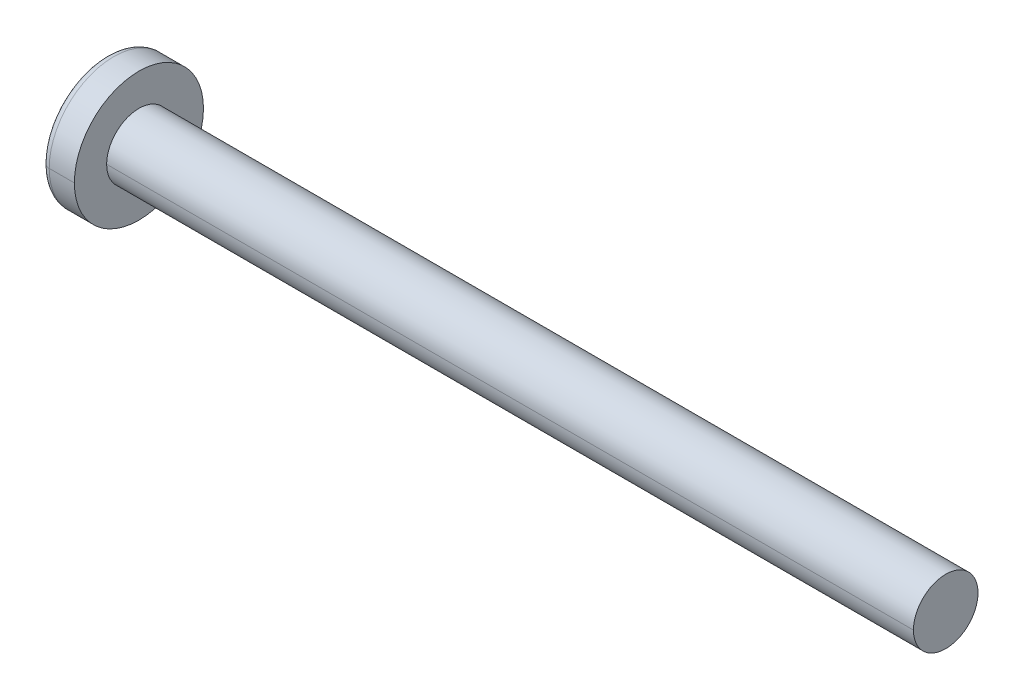
ISO-10303-21;
HEADER;
FILE_DESCRIPTION(('STEP AP214'),'2;1');
FILE_NAME('part.step','',(''),(''),'','','');
FILE_SCHEMA(('AUTOMOTIVE_DESIGN { 1 0 10303 214 1 1 1 1 }'));
ENDSEC;
DATA;
#1=APPLICATION_CONTEXT('core data for automotive mechanical design processes');
#2=APPLICATION_PROTOCOL_DEFINITION('international standard','automotive_design',2000,#1);
#3=PRODUCT_CONTEXT('',#1,'mechanical');
#4=PRODUCT('Part','Part','',(#3));
#5=PRODUCT_RELATED_PRODUCT_CATEGORY('part','',(#4));
#6=PRODUCT_DEFINITION_FORMATION('','',#4);
#7=PRODUCT_DEFINITION_CONTEXT('part definition',#1,'design');
#8=PRODUCT_DEFINITION('design','',#6,#7);
#9=PRODUCT_DEFINITION_SHAPE('','',#8);
#10=(LENGTH_UNIT() NAMED_UNIT(*) SI_UNIT(.MILLI.,.METRE.));
#11=(NAMED_UNIT(*) PLANE_ANGLE_UNIT() SI_UNIT($,.RADIAN.));
#12=(NAMED_UNIT(*) SI_UNIT($,.STERADIAN.) SOLID_ANGLE_UNIT());
#13=UNCERTAINTY_MEASURE_WITH_UNIT(LENGTH_MEASURE(1.E-05),#10,'distance_accuracy_value','');
#14=(GEOMETRIC_REPRESENTATION_CONTEXT(3) GLOBAL_UNCERTAINTY_ASSIGNED_CONTEXT((#13)) GLOBAL_UNIT_ASSIGNED_CONTEXT((#10,
#11,#12)) REPRESENTATION_CONTEXT('',''));
#15=CARTESIAN_POINT('',(0.,0.,0.));
#16=DIRECTION('',(0.,0.,1.));
#17=DIRECTION('',(1.,0.,0.));
#18=AXIS2_PLACEMENT_3D('',#15,#16,#17);
#19=CARTESIAN_POINT('',(1.37075949367089,-0.101772151898734,0.));
#20=DIRECTION('',(-0.100331502261417,0.994954064092392,0.));
#21=DIRECTION('',(0.,0.,1.));
#22=AXIS2_PLACEMENT_3D('',#19,#20,#21);
#23=PLANE('',#22);
#24=CARTESIAN_POINT('',(3.19174554351625,0.081856693463823,0.));
#25=DIRECTION('',(-0.100331502261417,0.994954064092392,0.));
#26=DIRECTION('',(-0.994954064092392,-0.100331502261417,0.));
#27=AXIS2_PLACEMENT_3D('',#24,#25,#26);
#28=CIRCLE('',#27,3.1989422229361);
#29=CARTESIAN_POINT('',(0.0177814447975943,-0.238206913129655,0.238206913129654));
#30=VERTEX_POINT('',#29);
#31=CARTESIAN_POINT('',(0.118330716626355,-0.22806749076037,0.831444314172418));
#32=VERTEX_POINT('',#31);
#33=EDGE_CURVE('E226',#30,#32,#28,.T.);
#34=ORIENTED_EDGE('',*,*,#33,.T.);
#35=DIRECTION('',(0.830201128729582,0.0837177608802956,-0.551141925795269));
#36=VECTOR('',#35,1.);
#37=CARTESIAN_POINT('',(0.,-0.240000000000002,0.91));
#38=LINE('',#37,#36);
#39=CARTESIAN_POINT('',(1.19,-0.12,0.12));
#40=VERTEX_POINT('',#39);
#41=EDGE_CURVE('E11',#32,#40,#38,.T.);
#42=ORIENTED_EDGE('',*,*,#41,.T.);
#43=DIRECTION('',(0.989983749746913,0.0998302940921257,-0.0998302940921253));
#44=VECTOR('',#43,1.);
#45=CARTESIAN_POINT('',(1.38081767298512,-0.100757881715786,0.100757881715786));
#46=LINE('',#45,#44);
#47=EDGE_CURVE('E239',#30,#40,#46,.T.);
#48=ORIENTED_EDGE('',*,*,#47,.F.);
#49=EDGE_LOOP('',(#34,#42,#48));
#50=FACE_BOUND('',#49,.T.);
#51=ADVANCED_FACE('F17',(#50),#23,.T.);
#52=CARTESIAN_POINT('',(1.37075949367089,0.101772151898734,0.));
#53=DIRECTION('',(-0.100331502261418,-0.994954064092392,0.));
#54=DIRECTION('',(-0.994954064092392,0.100331502261418,0.));
#55=AXIS2_PLACEMENT_3D('',#52,#53,#54);
#56=PLANE('',#55);
#57=CARTESIAN_POINT('',(3.19174554351626,-0.0818566934638239,0.));
#58=DIRECTION('',(-0.100331502261418,-0.994954064092392,0.));
#59=DIRECTION('',(0.994954064092392,-0.100331502261418,0.));
#60=AXIS2_PLACEMENT_3D('',#57,#58,#59);
#61=CIRCLE('',#60,3.1989422229361);
#62=CARTESIAN_POINT('',(0.118330716626357,0.228067490760365,0.831444314172419));
#63=VERTEX_POINT('',#62);
#64=CARTESIAN_POINT('',(0.0177814447975952,0.238206913129654,0.238206913129654));
#65=VERTEX_POINT('',#64);
#66=EDGE_CURVE('E227',#63,#65,#61,.T.);
#67=ORIENTED_EDGE('',*,*,#66,.T.);
#68=DIRECTION('',(-0.989983749746913,0.0998302940921254,0.0998302940921253));
#69=VECTOR('',#68,1.);
#70=CARTESIAN_POINT('',(1.38081767298512,0.100757881715786,0.100757881715786));
#71=LINE('',#70,#69);
#72=CARTESIAN_POINT('',(1.19,0.12,0.12));
#73=VERTEX_POINT('',#72);
#74=EDGE_CURVE('E244',#73,#65,#71,.T.);
#75=ORIENTED_EDGE('',*,*,#74,.F.);
#76=DIRECTION('',(0.830201128729582,-0.0837177608802921,-0.551141925795269));
#77=VECTOR('',#76,1.);
#78=CARTESIAN_POINT('',(0.,0.239999999999997,0.91));
#79=LINE('',#78,#77);
#80=EDGE_CURVE('E28',#63,#73,#79,.T.);
#81=ORIENTED_EDGE('',*,*,#80,.F.);
#82=EDGE_LOOP('',(#67,#75,#81));
#83=FACE_BOUND('',#82,.T.);
#84=ADVANCED_FACE('F413',(#83),#56,.T.);
#85=CARTESIAN_POINT('',(1.19,-0.12,0.12));
#86=DIRECTION('',(0.553083521918191,0.,0.833125811497021));
#87=DIRECTION('',(0.,-1.,0.));
#88=AXIS2_PLACEMENT_3D('',#85,#86,#87);
#89=PLANE('',#88);
#90=ORIENTED_EDGE('',*,*,#80,.T.);
#91=DIRECTION('',(0.,-1.,0.));
#92=VECTOR('',#91,1.);
#93=CARTESIAN_POINT('',(1.19,0.12,0.12));
#94=LINE('',#93,#92);
#95=EDGE_CURVE('E195',#73,#40,#94,.T.);
#96=ORIENTED_EDGE('',*,*,#95,.T.);
#97=ORIENTED_EDGE('',*,*,#41,.F.);
#98=CARTESIAN_POINT('',(2.64043280070582,0.,-0.842892363493775));
#99=DIRECTION('',(0.553083521918191,0.,0.833125811497021));
#100=DIRECTION('',(0.833125811497021,0.,-0.553083521918191));
#101=AXIS2_PLACEMENT_3D('',#98,#99,#100);
#102=CIRCLE('',#101,3.03585523585001);
#103=EDGE_CURVE('E223',#63,#32,#102,.T.);
#104=ORIENTED_EDGE('',*,*,#103,.F.);
#105=EDGE_LOOP('',(#90,#96,#97,#104));
#106=FACE_BOUND('',#105,.T.);
#107=ADVANCED_FACE('F418',(#106),#89,.F.);
#108=CARTESIAN_POINT('',(1.37075949367089,0.101772151898734,0.));
#109=DIRECTION('',(-0.100331502261418,-0.994954064092392,0.));
#110=DIRECTION('',(-0.994954064092392,0.100331502261418,0.));
#111=AXIS2_PLACEMENT_3D('',#108,#109,#110);
#112=PLANE('',#111);
#113=CARTESIAN_POINT('',(3.19174554351626,-0.0818566934638239,0.));
#114=DIRECTION('',(-0.100331502261418,-0.994954064092392,0.));
#115=DIRECTION('',(0.994954064092392,-0.100331502261418,0.));
#116=AXIS2_PLACEMENT_3D('',#113,#114,#115);
#117=CIRCLE('',#116,3.1989422229361);
#118=CARTESIAN_POINT('',(0.0177814447975956,0.238206913129655,-0.238206913129654));
#119=VERTEX_POINT('',#118);
#120=CARTESIAN_POINT('',(0.118330716626357,0.228067490760371,-0.831444314172417));
#121=VERTEX_POINT('',#120);
#122=EDGE_CURVE('E203',#119,#121,#117,.T.);
#123=ORIENTED_EDGE('',*,*,#122,.T.);
#124=DIRECTION('',(0.830201128729583,-0.083717760880296,0.551141925795268));
#125=VECTOR('',#124,1.);
#126=CARTESIAN_POINT('',(0.,0.240000000000003,-0.91));
#127=LINE('',#126,#125);
#128=CARTESIAN_POINT('',(1.19,0.12,-0.12));
#129=VERTEX_POINT('',#128);
#130=EDGE_CURVE('E120',#121,#129,#127,.T.);
#131=ORIENTED_EDGE('',*,*,#130,.T.);
#132=DIRECTION('',(0.989983749746913,-0.0998302940921261,0.0998302940921258));
#133=VECTOR('',#132,1.);
#134=CARTESIAN_POINT('',(1.38081767298512,0.100757881715786,-0.100757881715786));
#135=LINE('',#134,#133);
#136=EDGE_CURVE('E269',#119,#129,#135,.T.);
#137=ORIENTED_EDGE('',*,*,#136,.F.);
#138=EDGE_LOOP('',(#123,#131,#137));
#139=FACE_BOUND('',#138,.T.);
#140=ADVANCED_FACE('F461',(#139),#112,.T.);
#141=CARTESIAN_POINT('',(1.37075949367089,-0.101772151898734,0.));
#142=DIRECTION('',(-0.100331502261417,0.994954064092392,0.));
#143=DIRECTION('',(0.,0.,1.));
#144=AXIS2_PLACEMENT_3D('',#141,#142,#143);
#145=PLANE('',#144);
#146=CARTESIAN_POINT('',(3.19174554351625,0.081856693463823,0.));
#147=DIRECTION('',(-0.100331502261417,0.994954064092392,0.));
#148=DIRECTION('',(-0.994954064092392,-0.100331502261417,0.));
#149=AXIS2_PLACEMENT_3D('',#146,#147,#148);
#150=CIRCLE('',#149,3.1989422229361);
#151=CARTESIAN_POINT('',(0.118330716626356,-0.228067490760364,-0.831444314172419));
#152=VERTEX_POINT('',#151);
#153=CARTESIAN_POINT('',(0.0177814447975943,-0.238206913129653,-0.238206913129655));
#154=VERTEX_POINT('',#153);
#155=EDGE_CURVE('E190',#152,#154,#150,.T.);
#156=ORIENTED_EDGE('',*,*,#155,.T.);
#157=DIRECTION('',(-0.989983749746913,-0.099830294092125,-0.0998302940921258));
#158=VECTOR('',#157,1.);
#159=CARTESIAN_POINT('',(1.38081767298512,-0.100757881715786,-0.100757881715786));
#160=LINE('',#159,#158);
#161=CARTESIAN_POINT('',(1.19,-0.12,-0.12));
#162=VERTEX_POINT('',#161);
#163=EDGE_CURVE('E192',#162,#154,#160,.T.);
#164=ORIENTED_EDGE('',*,*,#163,.F.);
#165=DIRECTION('',(0.830201128729583,0.0837177608802917,0.551141925795268));
#166=VECTOR('',#165,1.);
#167=CARTESIAN_POINT('',(0.,-0.239999999999996,-0.91));
#168=LINE('',#167,#166);
#169=EDGE_CURVE('E132',#152,#162,#168,.T.);
#170=ORIENTED_EDGE('',*,*,#169,.F.);
#171=EDGE_LOOP('',(#156,#164,#170));
#172=FACE_BOUND('',#171,.T.);
#173=ADVANCED_FACE('F188',(#172),#145,.T.);
#174=CARTESIAN_POINT('',(0.,0.240000000000003,-0.91));
#175=DIRECTION('',(0.55308352191819,0.,-0.833125811497022));
#176=DIRECTION('',(0.,-1.,0.));
#177=AXIS2_PLACEMENT_3D('',#174,#175,#176);
#178=PLANE('',#177);
#179=ORIENTED_EDGE('',*,*,#169,.T.);
#180=DIRECTION('',(0.,1.,0.));
#181=VECTOR('',#180,1.);
#182=CARTESIAN_POINT('',(1.19,-0.12,-0.12));
#183=LINE('',#182,#181);
#184=EDGE_CURVE('E300',#162,#129,#183,.T.);
#185=ORIENTED_EDGE('',*,*,#184,.T.);
#186=ORIENTED_EDGE('',*,*,#130,.F.);
#187=CARTESIAN_POINT('',(2.64043280070582,0.,0.842892363493774));
#188=DIRECTION('',(0.55308352191819,0.,-0.833125811497022));
#189=DIRECTION('',(-0.833125811497022,0.,-0.55308352191819));
#190=AXIS2_PLACEMENT_3D('',#187,#188,#189);
#191=CIRCLE('',#190,3.03585523585001);
#192=EDGE_CURVE('E198',#152,#121,#191,.T.);
#193=ORIENTED_EDGE('',*,*,#192,.F.);
#194=EDGE_LOOP('',(#179,#185,#186,#193));
#195=FACE_BOUND('',#194,.T.);
#196=ADVANCED_FACE('F199',(#195),#178,.F.);
#197=CARTESIAN_POINT('',(1.19,0.12,-0.12));
#198=DIRECTION('',(-1.,0.,0.));
#199=DIRECTION('',(0.,0.,1.));
#200=AXIS2_PLACEMENT_3D('',#197,#198,#199);
#201=PLANE('',#200);
#202=ORIENTED_EDGE('',*,*,#184,.F.);
#203=DIRECTION('',(0.,0.,1.));
#204=VECTOR('',#203,1.);
#205=CARTESIAN_POINT('',(1.19,-0.12,-0.12));
#206=LINE('',#205,#204);
#207=EDGE_CURVE('E297',#162,#40,#206,.T.);
#208=ORIENTED_EDGE('',*,*,#207,.T.);
#209=ORIENTED_EDGE('',*,*,#95,.F.);
#210=DIRECTION('',(0.,0.,-1.));
#211=VECTOR('',#210,1.);
#212=CARTESIAN_POINT('',(1.19,0.12,0.12));
#213=LINE('',#212,#211);
#214=EDGE_CURVE('E301',#73,#129,#213,.T.);
#215=ORIENTED_EDGE('',*,*,#214,.T.);
#216=EDGE_LOOP('',(#202,#208,#209,#215));
#217=FACE_BOUND('',#216,.T.);
#218=ADVANCED_FACE('F445',(#217),#201,.T.);
#219=CARTESIAN_POINT('',(0.,-0.91,-0.24));
#220=DIRECTION('',(0.55308352191819,-0.833125811497022,0.));
#221=DIRECTION('',(0.,0.,-1.));
#222=AXIS2_PLACEMENT_3D('',#219,#220,#221);
#223=PLANE('',#222);
#224=DIRECTION('',(0.830201128729583,0.551141925795268,-0.0837177608802937));
#225=VECTOR('',#224,1.);
#226=CARTESIAN_POINT('',(0.,-0.91,0.24));
#227=LINE('',#226,#225);
#228=CARTESIAN_POINT('',(0.118330716626355,-0.831444314172419,0.228067490760367));
#229=VERTEX_POINT('',#228);
#230=EDGE_CURVE('E243',#229,#40,#227,.T.);
#231=ORIENTED_EDGE('',*,*,#230,.T.);
#232=ORIENTED_EDGE('',*,*,#207,.F.);
#233=DIRECTION('',(0.830201128729583,0.551141925795268,0.0837177608802941));
#234=VECTOR('',#233,1.);
#235=CARTESIAN_POINT('',(0.,-0.91,-0.24));
#236=LINE('',#235,#234);
#237=CARTESIAN_POINT('',(0.118330716626355,-0.831444314172419,-0.228067490760368));
#238=VERTEX_POINT('',#237);
#239=EDGE_CURVE('E296',#238,#162,#236,.T.);
#240=ORIENTED_EDGE('',*,*,#239,.F.);
#241=CARTESIAN_POINT('',(2.64043280070582,0.842892363493772,0.));
#242=DIRECTION('',(0.55308352191819,-0.833125811497022,0.));
#243=DIRECTION('',(0.833125811497022,0.55308352191819,0.));
#244=AXIS2_PLACEMENT_3D('',#241,#242,#243);
#245=CIRCLE('',#244,3.03585523585001);
#246=CARTESIAN_POINT('',(0.111183443750788,-0.836189142383929,0.));
#247=VERTEX_POINT('',#246);
#248=EDGE_CURVE('E217',#247,#238,#245,.T.);
#249=ORIENTED_EDGE('',*,*,#248,.F.);
#250=CARTESIAN_POINT('',(2.64043280070582,0.842892363493772,0.));
#251=DIRECTION('',(0.55308352191819,-0.833125811497022,0.));
#252=DIRECTION('',(0.833125811497022,0.55308352191819,0.));
#253=AXIS2_PLACEMENT_3D('',#250,#251,#252);
#254=CIRCLE('',#253,3.03585523585001);
#255=EDGE_CURVE('E268',#229,#247,#254,.T.);
#256=ORIENTED_EDGE('',*,*,#255,.F.);
#257=EDGE_LOOP('',(#231,#232,#240,#249,#256));
#258=FACE_BOUND('',#257,.T.);
#259=ADVANCED_FACE('F525',(#258),#223,.F.);
#260=CARTESIAN_POINT('',(1.19,0.12,0.12));
#261=DIRECTION('',(0.553083521918191,0.833125811497021,0.));
#262=DIRECTION('',(0.,0.,-1.));
#263=AXIS2_PLACEMENT_3D('',#260,#261,#262);
#264=PLANE('',#263);
#265=DIRECTION('',(0.830201128729582,-0.551141925795269,0.083717760880294));
#266=VECTOR('',#265,1.);
#267=CARTESIAN_POINT('',(0.,0.91,-0.24));
#268=LINE('',#267,#266);
#269=CARTESIAN_POINT('',(0.118330716626357,0.831444314172418,-0.228067490760368));
#270=VERTEX_POINT('',#269);
#271=EDGE_CURVE('E173',#270,#129,#268,.T.);
#272=ORIENTED_EDGE('',*,*,#271,.T.);
#273=ORIENTED_EDGE('',*,*,#214,.F.);
#274=DIRECTION('',(0.830201128729582,-0.551141925795269,-0.0837177608802937));
#275=VECTOR('',#274,1.);
#276=CARTESIAN_POINT('',(0.,0.91,0.24));
#277=LINE('',#276,#275);
#278=CARTESIAN_POINT('',(0.118330716626358,0.831444314172418,0.228067490760367));
#279=VERTEX_POINT('',#278);
#280=EDGE_CURVE('E155',#279,#73,#277,.T.);
#281=ORIENTED_EDGE('',*,*,#280,.F.);
#282=CARTESIAN_POINT('',(2.64043280070582,-0.842892363493777,0.));
#283=DIRECTION('',(0.553083521918191,0.833125811497021,0.));
#284=DIRECTION('',(-0.833125811497021,0.553083521918191,0.));
#285=AXIS2_PLACEMENT_3D('',#282,#283,#284);
#286=CIRCLE('',#285,3.03585523585001);
#287=CARTESIAN_POINT('',(0.111183443750791,0.836189142383929,0.));
#288=VERTEX_POINT('',#287);
#289=EDGE_CURVE('E162',#288,#279,#286,.T.);
#290=ORIENTED_EDGE('',*,*,#289,.F.);
#291=CARTESIAN_POINT('',(2.64043280070582,-0.842892363493777,0.));
#292=DIRECTION('',(0.553083521918191,0.833125811497021,0.));
#293=DIRECTION('',(-0.833125811497021,0.553083521918191,0.));
#294=AXIS2_PLACEMENT_3D('',#291,#292,#293);
#295=CIRCLE('',#294,3.03585523585001);
#296=EDGE_CURVE('E234',#270,#288,#295,.T.);
#297=ORIENTED_EDGE('',*,*,#296,.F.);
#298=EDGE_LOOP('',(#272,#273,#281,#290,#297));
#299=FACE_BOUND('',#298,.T.);
#300=ADVANCED_FACE('F19',(#299),#264,.F.);
#301=CARTESIAN_POINT('',(26.6,1.,0.));
#302=DIRECTION('',(1.,0.,0.));
#303=DIRECTION('',(0.,1.,0.));
#304=AXIS2_PLACEMENT_3D('',#301,#302,#303);
#305=PLANE('',#304);
#306=CARTESIAN_POINT('',(26.6,0.,0.));
#307=DIRECTION('',(-1.,0.,0.));
#308=DIRECTION('',(0.,0.,1.));
#309=AXIS2_PLACEMENT_3D('',#306,#307,#308);
#310=CIRCLE('',#309,1.);
#311=CARTESIAN_POINT('',(26.6,0.,1.));
#312=VERTEX_POINT('',#311);
#313=CARTESIAN_POINT('',(26.6,0.,-1.));
#314=VERTEX_POINT('',#313);
#315=EDGE_CURVE('E262',#312,#314,#310,.T.);
#316=ORIENTED_EDGE('',*,*,#315,.F.);
#317=CARTESIAN_POINT('',(26.6,0.,0.));
#318=DIRECTION('',(-1.,0.,0.));
#319=DIRECTION('',(0.,0.,1.));
#320=AXIS2_PLACEMENT_3D('',#317,#318,#319);
#321=CIRCLE('',#320,1.);
#322=EDGE_CURVE('E254',#314,#312,#321,.T.);
#323=ORIENTED_EDGE('',*,*,#322,.F.);
#324=EDGE_LOOP('',(#316,#323));
#325=FACE_BOUND('',#324,.T.);
#326=ADVANCED_FACE('F409',(#325),#305,.T.);
#327=CARTESIAN_POINT('',(0.820084035097042,0.,0.));
#328=DIRECTION('',(-1.,0.,0.));
#329=DIRECTION('',(0.,0.,1.));
#330=AXIS2_PLACEMENT_3D('',#327,#328,#329);
#331=TOROIDAL_SURFACE('',#330,1.76,0.24);
#332=CARTESIAN_POINT('',(0.820084035097042,0.,-1.76));
#333=DIRECTION('',(0.,1.,0.));
#334=DIRECTION('',(0.,0.,1.));
#335=AXIS2_PLACEMENT_3D('',#332,#333,#334);
#336=CIRCLE('',#335,0.24);
#337=CARTESIAN_POINT('',(0.820084035097042,0.,-2.));
#338=VERTEX_POINT('',#337);
#339=CARTESIAN_POINT('',(0.627117875780583,0.,-1.90270270270271));
#340=VERTEX_POINT('',#339);
#341=EDGE_CURVE('E336',#338,#340,#336,.T.);
#342=ORIENTED_EDGE('',*,*,#341,.F.);
#343=CARTESIAN_POINT('',(0.820084035097042,0.,0.));
#344=DIRECTION('',(-1.,0.,0.));
#345=DIRECTION('',(0.,0.,1.));
#346=AXIS2_PLACEMENT_3D('',#343,#344,#345);
#347=CIRCLE('',#346,2.);
#348=CARTESIAN_POINT('',(0.820084035097042,0.,2.));
#349=VERTEX_POINT('',#348);
#350=EDGE_CURVE('E21',#338,#349,#347,.T.);
#351=ORIENTED_EDGE('',*,*,#350,.T.);
#352=CARTESIAN_POINT('',(0.820084035097042,0.,1.76));
#353=DIRECTION('',(0.,-1.,0.));
#354=DIRECTION('',(0.,0.,-1.));
#355=AXIS2_PLACEMENT_3D('',#352,#353,#354);
#356=CIRCLE('',#355,0.24);
#357=CARTESIAN_POINT('',(0.627117875780583,0.,1.90270270270271));
#358=VERTEX_POINT('',#357);
#359=EDGE_CURVE('E289',#349,#358,#356,.T.);
#360=ORIENTED_EDGE('',*,*,#359,.T.);
#361=CARTESIAN_POINT('',(0.627117875780583,0.,0.));
#362=DIRECTION('',(-1.,0.,0.));
#363=DIRECTION('',(0.,0.,1.));
#364=AXIS2_PLACEMENT_3D('',#361,#362,#363);
#365=CIRCLE('',#364,1.90270270270271);
#366=CARTESIAN_POINT('',(0.627117875780583,-1.90270270270271,0.));
#367=VERTEX_POINT('',#366);
#368=EDGE_CURVE('E233',#367,#358,#365,.T.);
#369=ORIENTED_EDGE('',*,*,#368,.F.);
#370=CARTESIAN_POINT('',(0.627117875780583,0.,0.));
#371=DIRECTION('',(-1.,0.,0.));
#372=DIRECTION('',(0.,0.,1.));
#373=AXIS2_PLACEMENT_3D('',#370,#371,#372);
#374=CIRCLE('',#373,1.90270270270271);
#375=EDGE_CURVE('E245',#340,#367,#374,.T.);
#376=ORIENTED_EDGE('',*,*,#375,.F.);
#377=EDGE_LOOP('',(#342,#351,#360,#369,#376));
#378=FACE_BOUND('',#377,.T.);
#379=ADVANCED_FACE('F384',(#378),#331,.T.);
#380=CARTESIAN_POINT('',(-25.4,0.,0.));
#381=DIRECTION('',(-1.,0.,0.));
#382=DIRECTION('',(0.,0.,1.));
#383=AXIS2_PLACEMENT_3D('',#380,#381,#382);
#384=CYLINDRICAL_SURFACE('',#383,2.);
#385=DIRECTION('',(-1.,0.,0.));
#386=VECTOR('',#385,1.);
#387=CARTESIAN_POINT('',(-25.4,0.,-2.));
#388=LINE('',#387,#386);
#389=CARTESIAN_POINT('',(1.6,0.,-2.));
#390=VERTEX_POINT('',#389);
#391=EDGE_CURVE('E263',#390,#338,#388,.T.);
#392=ORIENTED_EDGE('',*,*,#391,.F.);
#393=CARTESIAN_POINT('',(1.6,0.,0.));
#394=DIRECTION('',(-1.,0.,0.));
#395=DIRECTION('',(0.,0.,1.));
#396=AXIS2_PLACEMENT_3D('',#393,#394,#395);
#397=CIRCLE('',#396,2.);
#398=CARTESIAN_POINT('',(1.6,0.,2.));
#399=VERTEX_POINT('',#398);
#400=EDGE_CURVE('E342',#390,#399,#397,.T.);
#401=ORIENTED_EDGE('',*,*,#400,.T.);
#402=DIRECTION('',(-1.,0.,0.));
#403=VECTOR('',#402,1.);
#404=CARTESIAN_POINT('',(-25.4,0.,2.));
#405=LINE('',#404,#403);
#406=EDGE_CURVE('E258',#399,#349,#405,.T.);
#407=ORIENTED_EDGE('',*,*,#406,.T.);
#408=ORIENTED_EDGE('',*,*,#350,.F.);
#409=EDGE_LOOP('',(#392,#401,#407,#408));
#410=FACE_BOUND('',#409,.T.);
#411=ADVANCED_FACE('F398',(#410),#384,.T.);
#412=CARTESIAN_POINT('',(1.6,1.,0.));
#413=DIRECTION('',(-1.,0.,0.));
#414=DIRECTION('',(0.,0.,1.));
#415=AXIS2_PLACEMENT_3D('',#412,#413,#414);
#416=PLANE('',#415);
#417=CARTESIAN_POINT('',(1.6,0.,0.));
#418=DIRECTION('',(-1.,0.,0.));
#419=DIRECTION('',(0.,0.,1.));
#420=AXIS2_PLACEMENT_3D('',#417,#418,#419);
#421=CIRCLE('',#420,1.);
#422=CARTESIAN_POINT('',(1.6,0.,1.));
#423=VERTEX_POINT('',#422);
#424=CARTESIAN_POINT('',(1.6,0.,-1.));
#425=VERTEX_POINT('',#424);
#426=EDGE_CURVE('E277',#423,#425,#421,.T.);
#427=ORIENTED_EDGE('',*,*,#426,.T.);
#428=CARTESIAN_POINT('',(1.6,0.,0.));
#429=DIRECTION('',(-1.,0.,0.));
#430=DIRECTION('',(0.,0.,1.));
#431=AXIS2_PLACEMENT_3D('',#428,#429,#430);
#432=CIRCLE('',#431,1.);
#433=EDGE_CURVE('E257',#425,#423,#432,.T.);
#434=ORIENTED_EDGE('',*,*,#433,.T.);
#435=EDGE_LOOP('',(#427,#434));
#436=FACE_BOUND('',#435,.T.);
#437=CARTESIAN_POINT('',(1.6,0.,0.));
#438=DIRECTION('',(-1.,0.,0.));
#439=DIRECTION('',(0.,0.,1.));
#440=AXIS2_PLACEMENT_3D('',#437,#438,#439);
#441=CIRCLE('',#440,2.);
#442=EDGE_CURVE('E285',#399,#390,#441,.T.);
#443=ORIENTED_EDGE('',*,*,#442,.F.);
#444=ORIENTED_EDGE('',*,*,#400,.F.);
#445=EDGE_LOOP('',(#443,#444));
#446=FACE_BOUND('',#445,.T.);
#447=ADVANCED_FACE('F400',(#436,#446),#416,.F.);
#448=CARTESIAN_POINT('',(-25.4,0.,0.));
#449=DIRECTION('',(-1.,0.,0.));
#450=DIRECTION('',(0.,0.,1.));
#451=AXIS2_PLACEMENT_3D('',#448,#449,#450);
#452=CYLINDRICAL_SURFACE('',#451,1.);
#453=DIRECTION('',(-1.,0.,0.));
#454=VECTOR('',#453,1.);
#455=CARTESIAN_POINT('',(-25.4,0.,-1.));
#456=LINE('',#455,#454);
#457=EDGE_CURVE('E290',#314,#425,#456,.T.);
#458=ORIENTED_EDGE('',*,*,#457,.F.);
#459=ORIENTED_EDGE('',*,*,#322,.T.);
#460=DIRECTION('',(-1.,0.,0.));
#461=VECTOR('',#460,1.);
#462=CARTESIAN_POINT('',(-25.4,0.,1.));
#463=LINE('',#462,#461);
#464=EDGE_CURVE('E250',#312,#423,#463,.T.);
#465=ORIENTED_EDGE('',*,*,#464,.T.);
#466=ORIENTED_EDGE('',*,*,#433,.F.);
#467=EDGE_LOOP('',(#458,#459,#465,#466));
#468=FACE_BOUND('',#467,.T.);
#469=ADVANCED_FACE('F407',(#468),#452,.T.);
#470=CARTESIAN_POINT('',(1.37075949367089,0.,0.101772151898734));
#471=DIRECTION('',(-0.100331502261417,0.,-0.994954064092392));
#472=DIRECTION('',(-0.994954064092392,0.,0.100331502261417));
#473=AXIS2_PLACEMENT_3D('',#470,#471,#472);
#474=PLANE('',#473);
#475=CARTESIAN_POINT('',(3.19174554351626,0.,-0.0818566934638231));
#476=DIRECTION('',(-0.100331502261417,0.,-0.994954064092392));
#477=DIRECTION('',(-0.994954064092392,0.,0.100331502261417));
#478=AXIS2_PLACEMENT_3D('',#475,#476,#477);
#479=CIRCLE('',#478,3.1989422229361);
#480=EDGE_CURVE('E264',#229,#30,#479,.T.);
#481=ORIENTED_EDGE('',*,*,#480,.T.);
#482=ORIENTED_EDGE('',*,*,#47,.T.);
#483=ORIENTED_EDGE('',*,*,#230,.F.);
#484=EDGE_LOOP('',(#481,#482,#483));
#485=FACE_BOUND('',#484,.T.);
#486=ADVANCED_FACE('F432',(#485),#474,.T.);
#487=CARTESIAN_POINT('',(1.37075949367089,0.,0.101772151898734));
#488=DIRECTION('',(-0.100331502261417,0.,-0.994954064092392));
#489=DIRECTION('',(-0.994954064092392,0.,0.100331502261417));
#490=AXIS2_PLACEMENT_3D('',#487,#488,#489);
#491=PLANE('',#490);
#492=ORIENTED_EDGE('',*,*,#280,.T.);
#493=ORIENTED_EDGE('',*,*,#74,.T.);
#494=CARTESIAN_POINT('',(3.19174554351626,0.,-0.0818566934638231));
#495=DIRECTION('',(-0.100331502261417,0.,-0.994954064092392));
#496=DIRECTION('',(-0.994954064092392,0.,0.100331502261417));
#497=AXIS2_PLACEMENT_3D('',#494,#495,#496);
#498=CIRCLE('',#497,3.1989422229361);
#499=EDGE_CURVE('E238',#65,#279,#498,.T.);
#500=ORIENTED_EDGE('',*,*,#499,.T.);
#501=EDGE_LOOP('',(#492,#493,#500));
#502=FACE_BOUND('',#501,.T.);
#503=ADVANCED_FACE('F426',(#502),#491,.T.);
#504=CARTESIAN_POINT('',(1.37075949367089,0.,-0.101772151898734));
#505=DIRECTION('',(-0.100331502261418,0.,0.994954064092392));
#506=DIRECTION('',(0.,1.,0.));
#507=AXIS2_PLACEMENT_3D('',#504,#505,#506);
#508=PLANE('',#507);
#509=ORIENTED_EDGE('',*,*,#239,.T.);
#510=ORIENTED_EDGE('',*,*,#163,.T.);
#511=CARTESIAN_POINT('',(3.19174554351626,0.,0.0818566934638239));
#512=DIRECTION('',(-0.100331502261418,0.,0.994954064092392));
#513=DIRECTION('',(0.994954064092392,0.,0.100331502261418));
#514=AXIS2_PLACEMENT_3D('',#511,#512,#513);
#515=CIRCLE('',#514,3.1989422229361);
#516=EDGE_CURVE('E209',#154,#238,#515,.T.);
#517=ORIENTED_EDGE('',*,*,#516,.T.);
#518=EDGE_LOOP('',(#509,#510,#517));
#519=FACE_BOUND('',#518,.T.);
#520=ADVANCED_FACE('F423',(#519),#508,.T.);
#521=CARTESIAN_POINT('',(1.37075949367089,0.,-0.101772151898734));
#522=DIRECTION('',(-0.100331502261418,0.,0.994954064092392));
#523=DIRECTION('',(0.,1.,0.));
#524=AXIS2_PLACEMENT_3D('',#521,#522,#523);
#525=PLANE('',#524);
#526=CARTESIAN_POINT('',(3.19174554351626,0.,0.0818566934638239));
#527=DIRECTION('',(-0.100331502261418,0.,0.994954064092392));
#528=DIRECTION('',(0.994954064092392,0.,0.100331502261418));
#529=AXIS2_PLACEMENT_3D('',#526,#527,#528);
#530=CIRCLE('',#529,3.1989422229361);
#531=EDGE_CURVE('E278',#270,#119,#530,.T.);
#532=ORIENTED_EDGE('',*,*,#531,.T.);
#533=ORIENTED_EDGE('',*,*,#136,.T.);
#534=ORIENTED_EDGE('',*,*,#271,.F.);
#535=EDGE_LOOP('',(#532,#533,#534));
#536=FACE_BOUND('',#535,.T.);
#537=ADVANCED_FACE('F425',(#536),#525,.T.);
#538=CARTESIAN_POINT('',(3.2,0.,0.));
#539=DIRECTION('',(0.,0.,-1.));
#540=DIRECTION('',(0.,1.,0.));
#541=AXIS2_PLACEMENT_3D('',#538,#539,#540);
#542=SPHERICAL_SURFACE('',#541,3.2);
#543=CARTESIAN_POINT('',(3.2,0.,0.));
#544=DIRECTION('',(0.,0.,-1.));
#545=DIRECTION('',(0.,1.,0.));
#546=AXIS2_PLACEMENT_3D('',#543,#544,#545);
#547=CIRCLE('',#546,3.2);
#548=EDGE_CURVE('E249',#367,#247,#547,.T.);
#549=ORIENTED_EDGE('',*,*,#548,.F.);
#550=ORIENTED_EDGE('',*,*,#368,.T.);
#551=CARTESIAN_POINT('',(0.627117875780583,0.,0.));
#552=DIRECTION('',(-1.,0.,0.));
#553=DIRECTION('',(0.,0.,1.));
#554=AXIS2_PLACEMENT_3D('',#551,#552,#553);
#555=CIRCLE('',#554,1.90270270270271);
#556=CARTESIAN_POINT('',(0.627117875780583,1.9027027027027,0.));
#557=VERTEX_POINT('',#556);
#558=EDGE_CURVE('E328',#358,#557,#555,.T.);
#559=ORIENTED_EDGE('',*,*,#558,.T.);
#560=CARTESIAN_POINT('',(3.2,0.,0.));
#561=DIRECTION('',(0.,0.,1.));
#562=DIRECTION('',(1.,0.,0.));
#563=AXIS2_PLACEMENT_3D('',#560,#561,#562);
#564=CIRCLE('',#563,3.2);
#565=EDGE_CURVE('E230',#557,#288,#564,.T.);
#566=ORIENTED_EDGE('',*,*,#565,.T.);
#567=ORIENTED_EDGE('',*,*,#289,.T.);
#568=ORIENTED_EDGE('',*,*,#499,.F.);
#569=ORIENTED_EDGE('',*,*,#66,.F.);
#570=ORIENTED_EDGE('',*,*,#103,.T.);
#571=ORIENTED_EDGE('',*,*,#33,.F.);
#572=ORIENTED_EDGE('',*,*,#480,.F.);
#573=ORIENTED_EDGE('',*,*,#255,.T.);
#574=EDGE_LOOP('',(#549,#550,#559,#566,#567,#568,#569,#570,#571,#572,#573));
#575=FACE_BOUND('',#574,.T.);
#576=ADVANCED_FACE('F391',(#575),#542,.T.);
#577=CARTESIAN_POINT('',(3.2,0.,0.));
#578=DIRECTION('',(0.,0.,-1.));
#579=DIRECTION('',(0.,1.,0.));
#580=AXIS2_PLACEMENT_3D('',#577,#578,#579);
#581=SPHERICAL_SURFACE('',#580,3.2);
#582=CARTESIAN_POINT('',(0.627117875780583,0.,0.));
#583=DIRECTION('',(-1.,0.,0.));
#584=DIRECTION('',(0.,0.,1.));
#585=AXIS2_PLACEMENT_3D('',#582,#583,#584);
#586=CIRCLE('',#585,1.90270270270271);
#587=EDGE_CURVE('E221',#557,#340,#586,.T.);
#588=ORIENTED_EDGE('',*,*,#587,.T.);
#589=ORIENTED_EDGE('',*,*,#375,.T.);
#590=ORIENTED_EDGE('',*,*,#548,.T.);
#591=ORIENTED_EDGE('',*,*,#248,.T.);
#592=ORIENTED_EDGE('',*,*,#516,.F.);
#593=ORIENTED_EDGE('',*,*,#155,.F.);
#594=ORIENTED_EDGE('',*,*,#192,.T.);
#595=ORIENTED_EDGE('',*,*,#122,.F.);
#596=ORIENTED_EDGE('',*,*,#531,.F.);
#597=ORIENTED_EDGE('',*,*,#296,.T.);
#598=ORIENTED_EDGE('',*,*,#565,.F.);
#599=EDGE_LOOP('',(#588,#589,#590,#591,#592,#593,#594,#595,#596,#597,#598));
#600=FACE_BOUND('',#599,.T.);
#601=ADVANCED_FACE('F206',(#600),#581,.T.);
#602=CARTESIAN_POINT('',(-25.4,0.,0.));
#603=DIRECTION('',(-1.,0.,0.));
#604=DIRECTION('',(0.,0.,1.));
#605=AXIS2_PLACEMENT_3D('',#602,#603,#604);
#606=CYLINDRICAL_SURFACE('',#605,1.);
#607=ORIENTED_EDGE('',*,*,#315,.T.);
#608=ORIENTED_EDGE('',*,*,#457,.T.);
#609=ORIENTED_EDGE('',*,*,#426,.F.);
#610=ORIENTED_EDGE('',*,*,#464,.F.);
#611=EDGE_LOOP('',(#607,#608,#609,#610));
#612=FACE_BOUND('',#611,.T.);
#613=ADVANCED_FACE('F446',(#612),#606,.T.);
#614=CARTESIAN_POINT('',(-25.4,0.,0.));
#615=DIRECTION('',(-1.,0.,0.));
#616=DIRECTION('',(0.,0.,1.));
#617=AXIS2_PLACEMENT_3D('',#614,#615,#616);
#618=CYLINDRICAL_SURFACE('',#617,2.);
#619=ORIENTED_EDGE('',*,*,#442,.T.);
#620=ORIENTED_EDGE('',*,*,#391,.T.);
#621=CARTESIAN_POINT('',(0.820084035097042,0.,0.));
#622=DIRECTION('',(-1.,0.,0.));
#623=DIRECTION('',(0.,0.,1.));
#624=AXIS2_PLACEMENT_3D('',#621,#622,#623);
#625=CIRCLE('',#624,2.);
#626=EDGE_CURVE('E332',#349,#338,#625,.T.);
#627=ORIENTED_EDGE('',*,*,#626,.F.);
#628=ORIENTED_EDGE('',*,*,#406,.F.);
#629=EDGE_LOOP('',(#619,#620,#627,#628));
#630=FACE_BOUND('',#629,.T.);
#631=ADVANCED_FACE('F396',(#630),#618,.T.);
#632=CARTESIAN_POINT('',(0.820084035097042,0.,0.));
#633=DIRECTION('',(-1.,0.,0.));
#634=DIRECTION('',(0.,0.,1.));
#635=AXIS2_PLACEMENT_3D('',#632,#633,#634);
#636=TOROIDAL_SURFACE('',#635,1.76,0.24);
#637=ORIENTED_EDGE('',*,*,#626,.T.);
#638=ORIENTED_EDGE('',*,*,#341,.T.);
#639=ORIENTED_EDGE('',*,*,#587,.F.);
#640=ORIENTED_EDGE('',*,*,#558,.F.);
#641=ORIENTED_EDGE('',*,*,#359,.F.);
#642=EDGE_LOOP('',(#637,#638,#639,#640,#641));
#643=FACE_BOUND('',#642,.T.);
#644=ADVANCED_FACE('F389',(#643),#636,.T.);
#645=CLOSED_SHELL('',(#51,#84,#107,#140,#173,#196,#218,#259,#300,#326,#379,#411,#447,#469,#486,
#503,#520,#537,#576,#601,#613,#631,#644));
#646=MANIFOLD_SOLID_BREP('B1',#645);
#647=ADVANCED_BREP_SHAPE_REPRESENTATION('',(#18,#646),#14);
#648=SHAPE_DEFINITION_REPRESENTATION(#9,#647);
ENDSEC;
END-ISO-10303-21;
